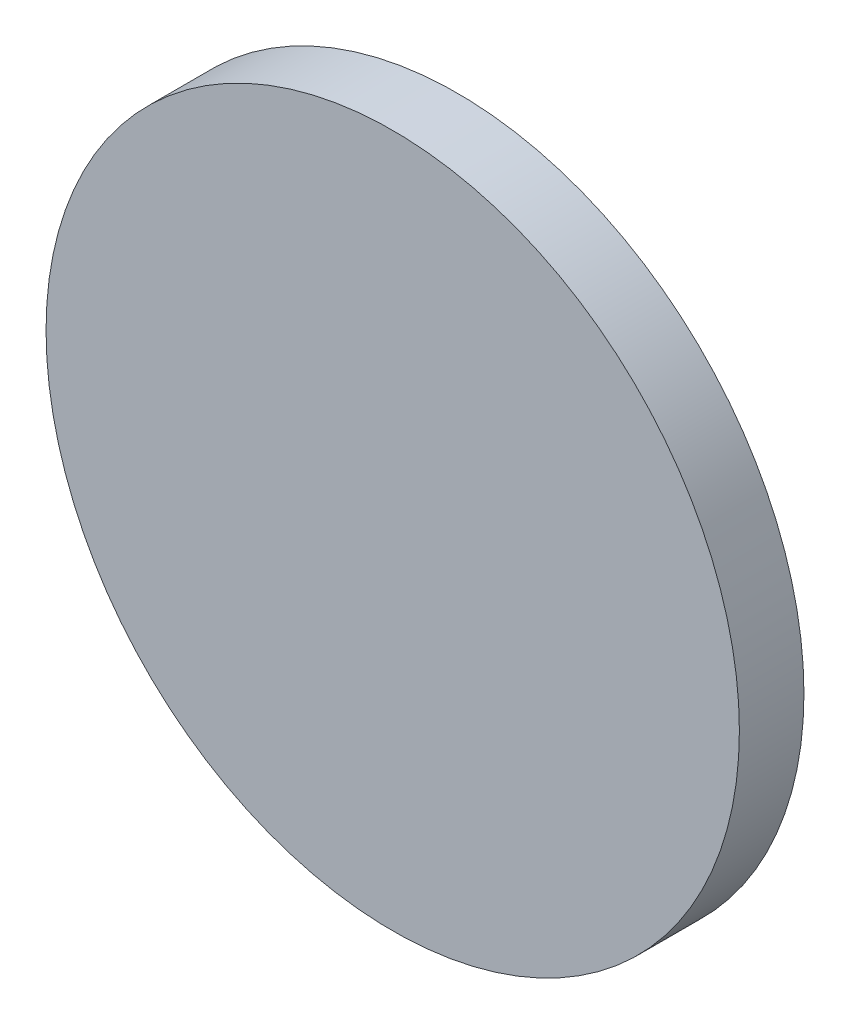
ISO-10303-21;
HEADER;
FILE_DESCRIPTION(('STEP AP214'),'2;1');
FILE_NAME('part.step','',(''),(''),'','','');
FILE_SCHEMA(('AUTOMOTIVE_DESIGN { 1 0 10303 214 1 1 1 1 }'));
ENDSEC;
DATA;
#1=APPLICATION_CONTEXT('core data for automotive mechanical design processes');
#2=APPLICATION_PROTOCOL_DEFINITION('international standard','automotive_design',2000,#1);
#3=PRODUCT_CONTEXT('',#1,'mechanical');
#4=PRODUCT('Part','Part','',(#3));
#5=PRODUCT_RELATED_PRODUCT_CATEGORY('part','',(#4));
#6=PRODUCT_DEFINITION_FORMATION('','',#4);
#7=PRODUCT_DEFINITION_CONTEXT('part definition',#1,'design');
#8=PRODUCT_DEFINITION('design','',#6,#7);
#9=PRODUCT_DEFINITION_SHAPE('','',#8);
#10=(LENGTH_UNIT() NAMED_UNIT(*) SI_UNIT(.MILLI.,.METRE.));
#11=(NAMED_UNIT(*) PLANE_ANGLE_UNIT() SI_UNIT($,.RADIAN.));
#12=(NAMED_UNIT(*) SI_UNIT($,.STERADIAN.) SOLID_ANGLE_UNIT());
#13=UNCERTAINTY_MEASURE_WITH_UNIT(LENGTH_MEASURE(1.E-05),#10,'distance_accuracy_value','');
#14=(GEOMETRIC_REPRESENTATION_CONTEXT(3) GLOBAL_UNCERTAINTY_ASSIGNED_CONTEXT((#13)) GLOBAL_UNIT_ASSIGNED_CONTEXT((#10,
#11,#12)) REPRESENTATION_CONTEXT('',''));
#15=CARTESIAN_POINT('',(0.,0.,0.));
#16=DIRECTION('',(0.,0.,1.));
#17=DIRECTION('',(1.,0.,0.));
#18=AXIS2_PLACEMENT_3D('',#15,#16,#17);
#19=CARTESIAN_POINT('',(0.,0.,10.));
#20=DIRECTION('',(0.,0.,-1.));
#21=DIRECTION('',(-1.,0.,0.));
#22=AXIS2_PLACEMENT_3D('',#19,#20,#21);
#23=CYLINDRICAL_SURFACE('',#22,53.6981425047604);
#24=CARTESIAN_POINT('',(0.,0.,10.));
#25=DIRECTION('',(0.,0.,1.));
#26=DIRECTION('',(1.,0.,0.));
#27=AXIS2_PLACEMENT_3D('',#24,#25,#26);
#28=CIRCLE('',#27,53.6981425047604);
#29=CARTESIAN_POINT('',(53.6981425047604,0.,10.));
#30=VERTEX_POINT('',#29);
#31=EDGE_CURVE('E10',#30,#30,#28,.T.);
#32=ORIENTED_EDGE('',*,*,#31,.F.);
#33=EDGE_LOOP('',(#32));
#34=FACE_BOUND('',#33,.T.);
#35=CARTESIAN_POINT('',(0.,0.,0.));
#36=DIRECTION('',(0.,0.,1.));
#37=DIRECTION('',(1.,0.,0.));
#38=AXIS2_PLACEMENT_3D('',#35,#36,#37);
#39=CIRCLE('',#38,53.6981425047604);
#40=CARTESIAN_POINT('',(53.6981425047604,0.,0.));
#41=VERTEX_POINT('',#40);
#42=EDGE_CURVE('E34',#41,#41,#39,.T.);
#43=ORIENTED_EDGE('',*,*,#42,.T.);
#44=EDGE_LOOP('',(#43));
#45=FACE_BOUND('',#44,.T.);
#46=ADVANCED_FACE('F31',(#34,#45),#23,.T.);
#47=CARTESIAN_POINT('',(0.,0.,10.));
#48=DIRECTION('',(0.,0.,1.));
#49=DIRECTION('',(1.,0.,0.));
#50=AXIS2_PLACEMENT_3D('',#47,#48,#49);
#51=PLANE('',#50);
#52=ORIENTED_EDGE('',*,*,#31,.T.);
#53=EDGE_LOOP('',(#52));
#54=FACE_BOUND('',#53,.T.);
#55=ADVANCED_FACE('F46',(#54),#51,.T.);
#56=CARTESIAN_POINT('',(0.,0.,0.));
#57=DIRECTION('',(0.,0.,1.));
#58=DIRECTION('',(1.,0.,0.));
#59=AXIS2_PLACEMENT_3D('',#56,#57,#58);
#60=PLANE('',#59);
#61=ORIENTED_EDGE('',*,*,#42,.F.);
#62=EDGE_LOOP('',(#61));
#63=FACE_BOUND('',#62,.T.);
#64=ADVANCED_FACE('F44',(#63),#60,.F.);
#65=CLOSED_SHELL('',(#46,#55,#64));
#66=MANIFOLD_SOLID_BREP('B2',#65);
#67=ADVANCED_BREP_SHAPE_REPRESENTATION('',(#18,#66),#14);
#68=SHAPE_DEFINITION_REPRESENTATION(#9,#67);
ENDSEC;
END-ISO-10303-21;
